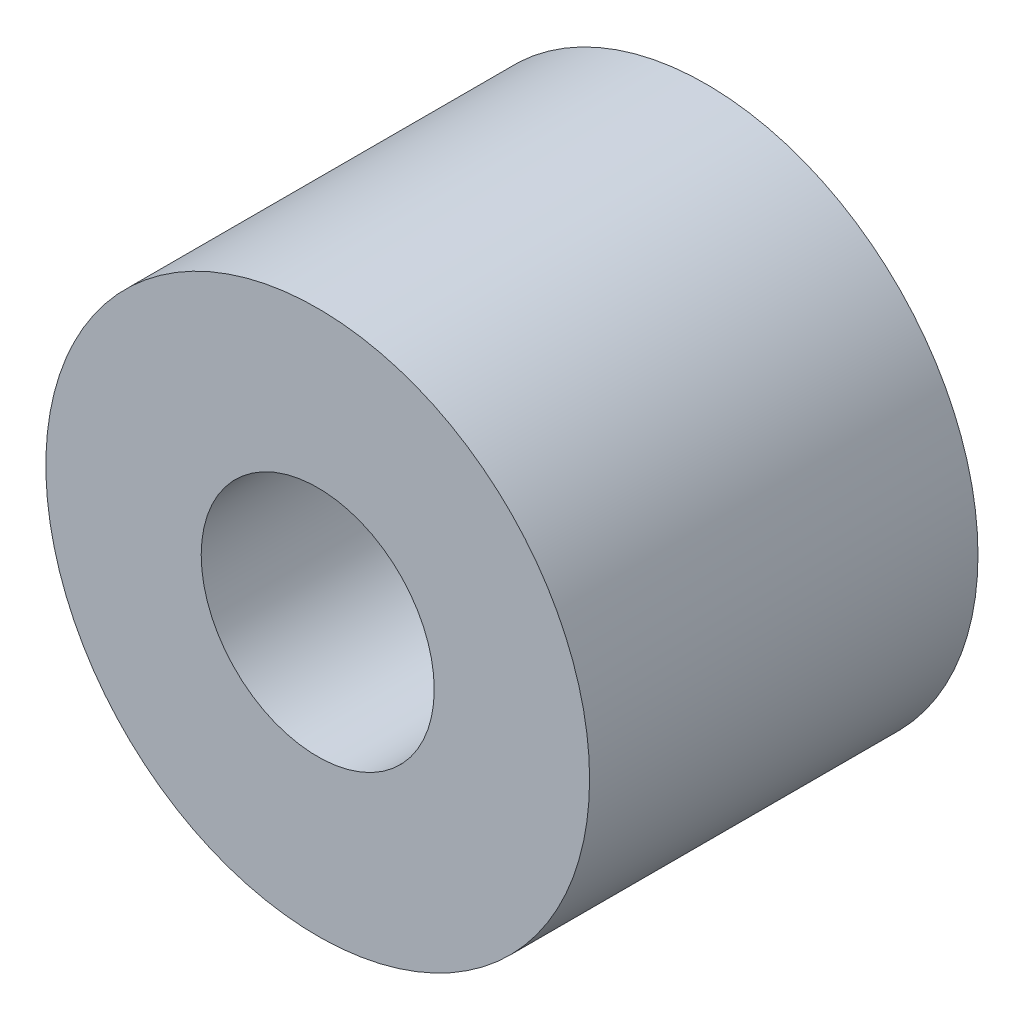
ISO-10303-21;
HEADER;
FILE_DESCRIPTION(('STEP AP214'),'2;1');
FILE_NAME('part.step','',(''),(''),'','','');
FILE_SCHEMA(('AUTOMOTIVE_DESIGN { 1 0 10303 214 1 1 1 1 }'));
ENDSEC;
DATA;
#1=APPLICATION_CONTEXT('core data for automotive mechanical design processes');
#2=APPLICATION_PROTOCOL_DEFINITION('international standard','automotive_design',2000,#1);
#3=PRODUCT_CONTEXT('',#1,'mechanical');
#4=PRODUCT('Part','Part','',(#3));
#5=PRODUCT_RELATED_PRODUCT_CATEGORY('part','',(#4));
#6=PRODUCT_DEFINITION_FORMATION('','',#4);
#7=PRODUCT_DEFINITION_CONTEXT('part definition',#1,'design');
#8=PRODUCT_DEFINITION('design','',#6,#7);
#9=PRODUCT_DEFINITION_SHAPE('','',#8);
#10=(LENGTH_UNIT() NAMED_UNIT(*) SI_UNIT(.MILLI.,.METRE.));
#11=(NAMED_UNIT(*) PLANE_ANGLE_UNIT() SI_UNIT($,.RADIAN.));
#12=(NAMED_UNIT(*) SI_UNIT($,.STERADIAN.) SOLID_ANGLE_UNIT());
#13=UNCERTAINTY_MEASURE_WITH_UNIT(LENGTH_MEASURE(1.E-05),#10,'distance_accuracy_value','');
#14=(GEOMETRIC_REPRESENTATION_CONTEXT(3) GLOBAL_UNCERTAINTY_ASSIGNED_CONTEXT((#13)) GLOBAL_UNIT_ASSIGNED_CONTEXT((#10,
#11,#12)) REPRESENTATION_CONTEXT('',''));
#15=CARTESIAN_POINT('',(0.,0.,0.));
#16=DIRECTION('',(0.,0.,1.));
#17=DIRECTION('',(1.,0.,0.));
#18=AXIS2_PLACEMENT_3D('',#15,#16,#17);
#19=CARTESIAN_POINT('',(0.,0.,5.));
#20=DIRECTION('',(0.,0.,1.));
#21=DIRECTION('',(1.,0.,0.));
#22=AXIS2_PLACEMENT_3D('',#19,#20,#21);
#23=PLANE('',#22);
#24=CARTESIAN_POINT('',(0.,0.,5.));
#25=DIRECTION('',(0.,0.,1.));
#26=DIRECTION('',(1.,0.,0.));
#27=AXIS2_PLACEMENT_3D('',#24,#25,#26);
#28=CIRCLE('',#27,3.5);
#29=CARTESIAN_POINT('',(3.5,0.,5.));
#30=VERTEX_POINT('',#29);
#31=EDGE_CURVE('E10',#30,#30,#28,.T.);
#32=ORIENTED_EDGE('',*,*,#31,.T.);
#33=EDGE_LOOP('',(#32));
#34=FACE_BOUND('',#33,.T.);
#35=CARTESIAN_POINT('',(0.,0.,5.));
#36=DIRECTION('',(0.,0.,1.));
#37=DIRECTION('',(1.,0.,0.));
#38=AXIS2_PLACEMENT_3D('',#35,#36,#37);
#39=CIRCLE('',#38,1.5);
#40=CARTESIAN_POINT('',(1.5,0.,5.));
#41=VERTEX_POINT('',#40);
#42=EDGE_CURVE('E50',#41,#41,#39,.T.);
#43=ORIENTED_EDGE('',*,*,#42,.F.);
#44=EDGE_LOOP('',(#43));
#45=FACE_BOUND('',#44,.T.);
#46=ADVANCED_FACE('F37',(#34,#45),#23,.T.);
#47=CARTESIAN_POINT('',(0.,0.,0.));
#48=DIRECTION('',(0.,0.,1.));
#49=DIRECTION('',(1.,0.,0.));
#50=AXIS2_PLACEMENT_3D('',#47,#48,#49);
#51=PLANE('',#50);
#52=CARTESIAN_POINT('',(0.,0.,0.));
#53=DIRECTION('',(0.,0.,1.));
#54=DIRECTION('',(1.,0.,0.));
#55=AXIS2_PLACEMENT_3D('',#52,#53,#54);
#56=CIRCLE('',#55,3.5);
#57=CARTESIAN_POINT('',(3.5,0.,0.));
#58=VERTEX_POINT('',#57);
#59=EDGE_CURVE('E41',#58,#58,#56,.T.);
#60=ORIENTED_EDGE('',*,*,#59,.F.);
#61=EDGE_LOOP('',(#60));
#62=FACE_BOUND('',#61,.T.);
#63=CARTESIAN_POINT('',(0.,0.,0.));
#64=DIRECTION('',(0.,0.,1.));
#65=DIRECTION('',(1.,0.,0.));
#66=AXIS2_PLACEMENT_3D('',#63,#64,#65);
#67=CIRCLE('',#66,1.5);
#68=CARTESIAN_POINT('',(1.5,0.,0.));
#69=VERTEX_POINT('',#68);
#70=EDGE_CURVE('E52',#69,#69,#67,.T.);
#71=ORIENTED_EDGE('',*,*,#70,.T.);
#72=EDGE_LOOP('',(#71));
#73=FACE_BOUND('',#72,.T.);
#74=ADVANCED_FACE('F64',(#62,#73),#51,.F.);
#75=CARTESIAN_POINT('',(0.,0.,5.));
#76=DIRECTION('',(0.,0.,-1.));
#77=DIRECTION('',(-1.,0.,0.));
#78=AXIS2_PLACEMENT_3D('',#75,#76,#77);
#79=CYLINDRICAL_SURFACE('',#78,3.5);
#80=ORIENTED_EDGE('',*,*,#31,.F.);
#81=EDGE_LOOP('',(#80));
#82=FACE_BOUND('',#81,.T.);
#83=ORIENTED_EDGE('',*,*,#59,.T.);
#84=EDGE_LOOP('',(#83));
#85=FACE_BOUND('',#84,.T.);
#86=ADVANCED_FACE('F39',(#82,#85),#79,.T.);
#87=CARTESIAN_POINT('',(0.,0.,5.));
#88=DIRECTION('',(0.,0.,-1.));
#89=DIRECTION('',(-1.,0.,0.));
#90=AXIS2_PLACEMENT_3D('',#87,#88,#89);
#91=CYLINDRICAL_SURFACE('',#90,1.5);
#92=ORIENTED_EDGE('',*,*,#42,.T.);
#93=EDGE_LOOP('',(#92));
#94=FACE_BOUND('',#93,.T.);
#95=ORIENTED_EDGE('',*,*,#70,.F.);
#96=EDGE_LOOP('',(#95));
#97=FACE_BOUND('',#96,.T.);
#98=ADVANCED_FACE('F60',(#94,#97),#91,.F.);
#99=CLOSED_SHELL('',(#46,#74,#86,#98));
#100=MANIFOLD_SOLID_BREP('B2',#99);
#101=ADVANCED_BREP_SHAPE_REPRESENTATION('',(#18,#100),#14);
#102=SHAPE_DEFINITION_REPRESENTATION(#9,#101);
ENDSEC;
END-ISO-10303-21;
